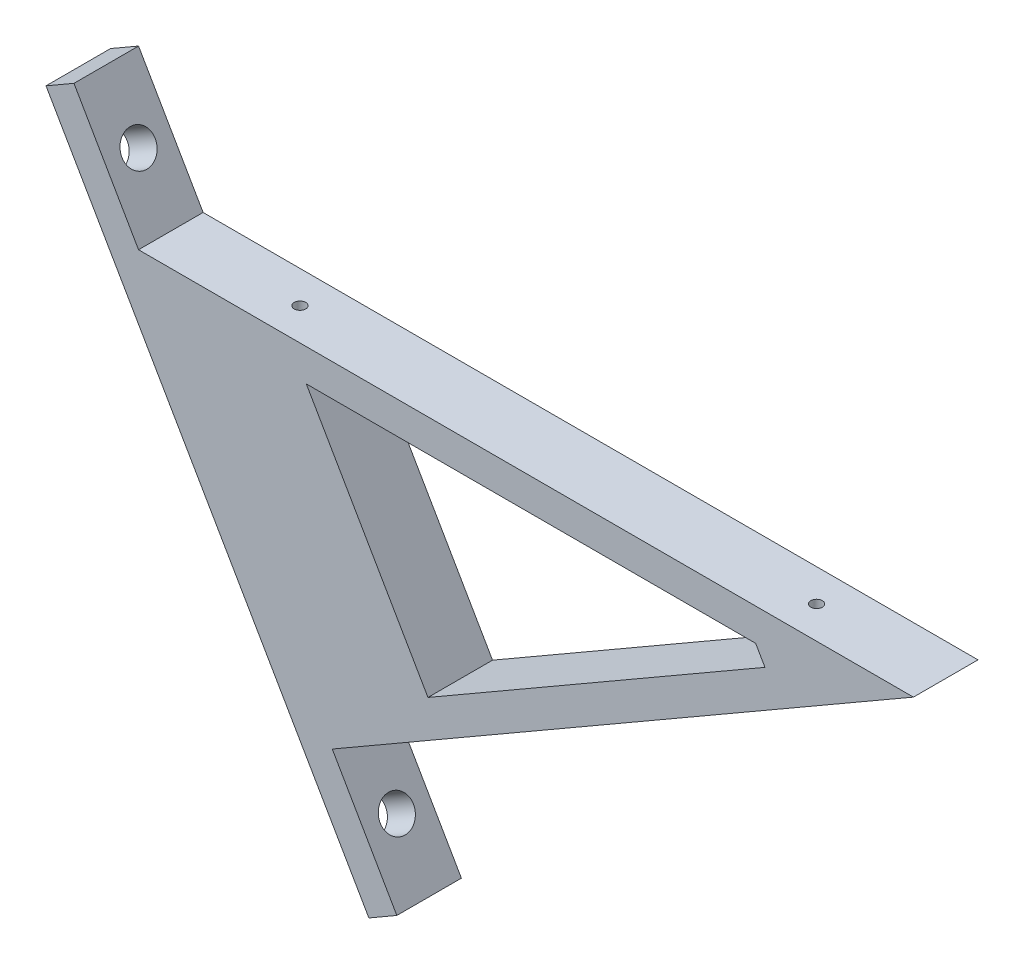
ISO-10303-21;
HEADER;
FILE_DESCRIPTION(('STEP AP214'),'2;1');
FILE_NAME('part.step','',(''),(''),'','','');
FILE_SCHEMA(('AUTOMOTIVE_DESIGN { 1 0 10303 214 1 1 1 1 }'));
ENDSEC;
DATA;
#1=APPLICATION_CONTEXT('core data for automotive mechanical design processes');
#2=APPLICATION_PROTOCOL_DEFINITION('international standard','automotive_design',2000,#1);
#3=PRODUCT_CONTEXT('',#1,'mechanical');
#4=PRODUCT('Part','Part','',(#3));
#5=PRODUCT_RELATED_PRODUCT_CATEGORY('part','',(#4));
#6=PRODUCT_DEFINITION_FORMATION('','',#4);
#7=PRODUCT_DEFINITION_CONTEXT('part definition',#1,'design');
#8=PRODUCT_DEFINITION('design','',#6,#7);
#9=PRODUCT_DEFINITION_SHAPE('','',#8);
#10=(LENGTH_UNIT() NAMED_UNIT(*) SI_UNIT(.MILLI.,.METRE.));
#11=(NAMED_UNIT(*) PLANE_ANGLE_UNIT() SI_UNIT($,.RADIAN.));
#12=(NAMED_UNIT(*) SI_UNIT($,.STERADIAN.) SOLID_ANGLE_UNIT());
#13=UNCERTAINTY_MEASURE_WITH_UNIT(LENGTH_MEASURE(1.E-05),#10,'distance_accuracy_value','');
#14=(GEOMETRIC_REPRESENTATION_CONTEXT(3) GLOBAL_UNCERTAINTY_ASSIGNED_CONTEXT((#13)) GLOBAL_UNIT_ASSIGNED_CONTEXT((#10,
#11,#12)) REPRESENTATION_CONTEXT('',''));
#15=CARTESIAN_POINT('',(0.,0.,0.));
#16=DIRECTION('',(0.,0.,1.));
#17=DIRECTION('',(1.,0.,0.));
#18=AXIS2_PLACEMENT_3D('',#15,#16,#17);
#19=CARTESIAN_POINT('',(0.,-6.35000000000023,12.7));
#20=DIRECTION('',(0.,1.,0.));
#21=DIRECTION('',(0.,0.,1.));
#22=AXIS2_PLACEMENT_3D('',#19,#20,#21);
#23=PLANE('',#22);
#24=DIRECTION('',(1.,0.,0.));
#25=VECTOR('',#24,1.);
#26=CARTESIAN_POINT('',(0.,-6.35000000000023,0.));
#27=LINE('',#26,#25);
#28=CARTESIAN_POINT('',(-119.404432115813,-6.35000000000023,0.));
#29=VERTEX_POINT('',#28);
#30=CARTESIAN_POINT('',(-31.0308710467701,-6.35000000000023,0.));
#31=VERTEX_POINT('',#30);
#32=EDGE_CURVE('E175',#29,#31,#27,.T.);
#33=ORIENTED_EDGE('',*,*,#32,.T.);
#34=DIRECTION('',(0.,0.,-1.));
#35=VECTOR('',#34,1.);
#36=CARTESIAN_POINT('',(-31.0308710467701,-6.35000000000023,12.7));
#37=LINE('',#36,#35);
#38=CARTESIAN_POINT('',(-31.0308710467701,-6.35000000000023,12.7));
#39=VERTEX_POINT('',#38);
#40=EDGE_CURVE('E11',#39,#31,#37,.T.);
#41=ORIENTED_EDGE('',*,*,#40,.F.);
#42=DIRECTION('',(1.,0.,0.));
#43=VECTOR('',#42,1.);
#44=CARTESIAN_POINT('',(0.,-6.35000000000023,12.7));
#45=LINE('',#44,#43);
#46=CARTESIAN_POINT('',(-119.404432115813,-6.35000000000023,12.7));
#47=VERTEX_POINT('',#46);
#48=EDGE_CURVE('E141',#47,#39,#45,.T.);
#49=ORIENTED_EDGE('',*,*,#48,.F.);
#50=DIRECTION('',(0.,0.,-1.));
#51=VECTOR('',#50,1.);
#52=CARTESIAN_POINT('',(-119.404432115813,-6.35000000000023,12.7));
#53=LINE('',#52,#51);
#54=EDGE_CURVE('E182',#47,#29,#53,.T.);
#55=ORIENTED_EDGE('',*,*,#54,.T.);
#56=EDGE_LOOP('',(#33,#41,#49,#55));
#57=FACE_BOUND('',#56,.T.);
#58=ADVANCED_FACE('F41',(#57),#23,.F.);
#59=CARTESIAN_POINT('',(-26.0227839420932,-15.0242613140311,12.7));
#60=DIRECTION('',(0.866025403784436,0.500000000000005,0.));
#61=DIRECTION('',(-0.500000000000005,0.866025403784436,0.));
#62=AXIS2_PLACEMENT_3D('',#59,#60,#61);
#63=PLANE('',#62);
#64=DIRECTION('',(0.500000000000005,-0.866025403784436,0.));
#65=VECTOR('',#64,1.);
#66=CARTESIAN_POINT('',(-26.0227839420932,-15.0242613140311,0.));
#67=LINE('',#66,#65);
#68=CARTESIAN_POINT('',(-29.197783942093,-9.52500000000024,0.));
#69=VERTEX_POINT('',#68);
#70=EDGE_CURVE('E146',#31,#69,#67,.T.);
#71=ORIENTED_EDGE('',*,*,#70,.T.);
#72=DIRECTION('',(0.,0.,-1.));
#73=VECTOR('',#72,1.);
#74=CARTESIAN_POINT('',(-29.197783942093,-9.52500000000024,12.7));
#75=LINE('',#74,#73);
#76=CARTESIAN_POINT('',(-29.197783942093,-9.52500000000024,12.7));
#77=VERTEX_POINT('',#76);
#78=EDGE_CURVE('E51',#77,#69,#75,.T.);
#79=ORIENTED_EDGE('',*,*,#78,.F.);
#80=DIRECTION('',(0.500000000000005,-0.866025403784436,0.));
#81=VECTOR('',#80,1.);
#82=CARTESIAN_POINT('',(-26.0227839420932,-15.0242613140311,12.7));
#83=LINE('',#82,#81);
#84=EDGE_CURVE('E135',#39,#77,#83,.T.);
#85=ORIENTED_EDGE('',*,*,#84,.F.);
#86=ORIENTED_EDGE('',*,*,#40,.T.);
#87=EDGE_LOOP('',(#71,#79,#85,#86));
#88=FACE_BOUND('',#87,.T.);
#89=ADVANCED_FACE('F145',(#88),#63,.F.);
#90=CARTESIAN_POINT('',(-3.17499999999995,5.49926131403098,12.7));
#91=DIRECTION('',(0.500000000000007,-0.866025403784434,0.));
#92=DIRECTION('',(0.866025403784434,0.500000000000008,0.));
#93=AXIS2_PLACEMENT_3D('',#90,#91,#92);
#94=PLANE('',#93);
#95=DIRECTION('',(-0.866025403784434,-0.500000000000008,0.));
#96=VECTOR('',#95,1.);
#97=CARTESIAN_POINT('',(-3.17499999999995,5.49926131403098,0.));
#98=LINE('',#97,#96);
#99=CARTESIAN_POINT('',(-95.4779547438745,-47.7918744543439,0.));
#100=VERTEX_POINT('',#99);
#101=EDGE_CURVE('E98',#69,#100,#98,.T.);
#102=ORIENTED_EDGE('',*,*,#101,.T.);
#103=DIRECTION('',(0.,0.,-1.));
#104=VECTOR('',#103,1.);
#105=CARTESIAN_POINT('',(-95.4779547438745,-47.7918744543439,12.7));
#106=LINE('',#105,#104);
#107=CARTESIAN_POINT('',(-95.4779547438745,-47.7918744543439,12.7));
#108=VERTEX_POINT('',#107);
#109=EDGE_CURVE('E147',#108,#100,#106,.T.);
#110=ORIENTED_EDGE('',*,*,#109,.F.);
#111=DIRECTION('',(-0.866025403784434,-0.500000000000008,0.));
#112=VECTOR('',#111,1.);
#113=CARTESIAN_POINT('',(-3.17499999999995,5.49926131403098,12.7));
#114=LINE('',#113,#112);
#115=EDGE_CURVE('E139',#77,#108,#114,.T.);
#116=ORIENTED_EDGE('',*,*,#115,.F.);
#117=ORIENTED_EDGE('',*,*,#78,.T.);
#118=EDGE_LOOP('',(#102,#110,#116,#117));
#119=FACE_BOUND('',#118,.T.);
#120=ADVANCED_FACE('F149',(#119),#94,.F.);
#121=CARTESIAN_POINT('',(0.,0.,12.7));
#122=DIRECTION('',(0.,1.,0.));
#123=DIRECTION('',(-1.,0.,0.));
#124=AXIS2_PLACEMENT_3D('',#121,#122,#123);
#125=PLANE('',#124);
#126=CARTESIAN_POINT('',(-127.,-1.89677496629516E-13,6.35));
#127=DIRECTION('',(0.,1.,0.));
#128=DIRECTION('',(-1.,0.,0.));
#129=AXIS2_PLACEMENT_3D('',#126,#127,#128);
#130=CIRCLE('',#129,1.13029999999999);
#131=CARTESIAN_POINT('',(-128.1303,-1.91365626349519E-13,6.35));
#132=VERTEX_POINT('',#131);
#133=EDGE_CURVE('E251',#132,#132,#130,.T.);
#134=ORIENTED_EDGE('',*,*,#133,.F.);
#135=EDGE_LOOP('',(#134));
#136=FACE_BOUND('',#135,.T.);
#137=CARTESIAN_POINT('',(-25.4,0.,6.35));
#138=DIRECTION('',(0.,1.,0.));
#139=DIRECTION('',(-1.,0.,0.));
#140=AXIS2_PLACEMENT_3D('',#137,#138,#139);
#141=CIRCLE('',#140,1.1303);
#142=CARTESIAN_POINT('',(-26.5303,0.,6.35));
#143=VERTEX_POINT('',#142);
#144=EDGE_CURVE('E248',#143,#143,#141,.T.);
#145=ORIENTED_EDGE('',*,*,#144,.F.);
#146=EDGE_LOOP('',(#145));
#147=FACE_BOUND('',#146,.T.);
#148=DIRECTION('',(1.,0.,0.));
#149=VECTOR('',#148,1.);
#150=CARTESIAN_POINT('',(0.,0.,0.));
#151=LINE('',#150,#149);
#152=CARTESIAN_POINT('',(-152.4,-2.22044604925031E-13,0.));
#153=VERTEX_POINT('',#152);
#154=CARTESIAN_POINT('',(0.,0.,0.));
#155=VERTEX_POINT('',#154);
#156=EDGE_CURVE('E155',#153,#155,#151,.T.);
#157=ORIENTED_EDGE('',*,*,#156,.F.);
#158=DIRECTION('',(0.,0.,-1.));
#159=VECTOR('',#158,1.);
#160=CARTESIAN_POINT('',(-152.4,-2.22044604925031E-13,12.7));
#161=LINE('',#160,#159);
#162=CARTESIAN_POINT('',(-152.4,-2.22044604925031E-13,12.7));
#163=VERTEX_POINT('',#162);
#164=EDGE_CURVE('E112',#163,#153,#161,.T.);
#165=ORIENTED_EDGE('',*,*,#164,.F.);
#166=DIRECTION('',(1.,0.,0.));
#167=VECTOR('',#166,1.);
#168=CARTESIAN_POINT('',(0.,0.,12.7));
#169=LINE('',#168,#167);
#170=CARTESIAN_POINT('',(0.,0.,12.7));
#171=VERTEX_POINT('',#170);
#172=EDGE_CURVE('E181',#163,#171,#169,.T.);
#173=ORIENTED_EDGE('',*,*,#172,.T.);
#174=DIRECTION('',(0.,0.,-1.));
#175=VECTOR('',#174,1.);
#176=CARTESIAN_POINT('',(0.,0.,12.7));
#177=LINE('',#176,#175);
#178=EDGE_CURVE('E151',#171,#155,#177,.T.);
#179=ORIENTED_EDGE('',*,*,#178,.T.);
#180=EDGE_LOOP('',(#157,#165,#173,#179));
#181=FACE_BOUND('',#180,.T.);
#182=ADVANCED_FACE('F43',(#136,#147,#181),#125,.T.);
#183=CARTESIAN_POINT('',(-114.299999999999,-65.9911357683749,12.7));
#184=DIRECTION('',(-0.866025403784434,-0.500000000000008,0.));
#185=DIRECTION('',(0.500000000000008,-0.866025403784434,0.));
#186=AXIS2_PLACEMENT_3D('',#183,#184,#185);
#187=PLANE('',#186);
#188=CARTESIAN_POINT('',(-158.75,10.9985226280621,6.35));
#189=DIRECTION('',(0.866025403784434,0.500000000000008,0.));
#190=DIRECTION('',(-0.500000000000008,0.866025403784434,0.));
#191=AXIS2_PLACEMENT_3D('',#188,#189,#190);
#192=CIRCLE('',#191,3.2639);
#193=CARTESIAN_POINT('',(-160.38195,13.8251429434741,6.35));
#194=VERTEX_POINT('',#193);
#195=EDGE_CURVE('E259',#194,#194,#192,.T.);
#196=ORIENTED_EDGE('',*,*,#195,.F.);
#197=EDGE_LOOP('',(#196));
#198=FACE_BOUND('',#197,.T.);
#199=DIRECTION('',(-0.500000000000008,0.866025403784434,0.));
#200=VECTOR('',#199,1.);
#201=CARTESIAN_POINT('',(-114.299999999999,-65.9911357683749,0.));
#202=LINE('',#201,#200);
#203=CARTESIAN_POINT('',(-165.1,21.9970452561244,0.));
#204=VERTEX_POINT('',#203);
#205=EDGE_CURVE('E158',#153,#204,#202,.T.);
#206=ORIENTED_EDGE('',*,*,#205,.T.);
#207=DIRECTION('',(0.,0.,-1.));
#208=VECTOR('',#207,1.);
#209=CARTESIAN_POINT('',(-165.1,21.9970452561244,12.7));
#210=LINE('',#209,#208);
#211=CARTESIAN_POINT('',(-165.1,21.9970452561244,12.7));
#212=VERTEX_POINT('',#211);
#213=EDGE_CURVE('E195',#212,#204,#210,.T.);
#214=ORIENTED_EDGE('',*,*,#213,.F.);
#215=DIRECTION('',(-0.500000000000008,0.866025403784434,0.));
#216=VECTOR('',#215,1.);
#217=CARTESIAN_POINT('',(-114.299999999999,-65.9911357683749,12.7));
#218=LINE('',#217,#216);
#219=EDGE_CURVE('E201',#163,#212,#218,.T.);
#220=ORIENTED_EDGE('',*,*,#219,.F.);
#221=ORIENTED_EDGE('',*,*,#164,.T.);
#222=EDGE_LOOP('',(#206,#214,#220,#221));
#223=FACE_BOUND('',#222,.T.);
#224=ADVANCED_FACE('F199',(#198,#223),#187,.F.);
#225=CARTESIAN_POINT('',(-50.8000000000015,87.9881810244994,12.7));
#226=DIRECTION('',(0.500000000000009,-0.866025403784433,0.));
#227=DIRECTION('',(0.866025403784433,0.500000000000009,0.));
#228=AXIS2_PLACEMENT_3D('',#225,#226,#227);
#229=PLANE('',#228);
#230=DIRECTION('',(-0.866025403784433,-0.500000000000009,0.));
#231=VECTOR('',#230,1.);
#232=CARTESIAN_POINT('',(-50.8000000000015,87.9881810244994,0.));
#233=LINE('',#232,#231);
#234=CARTESIAN_POINT('',(-170.599261314031,18.8220452561244,0.));
#235=VERTEX_POINT('',#234);
#236=EDGE_CURVE('E161',#204,#235,#233,.T.);
#237=ORIENTED_EDGE('',*,*,#236,.T.);
#238=DIRECTION('',(0.,0.,-1.));
#239=VECTOR('',#238,1.);
#240=CARTESIAN_POINT('',(-170.599261314031,18.8220452561244,12.7));
#241=LINE('',#240,#239);
#242=CARTESIAN_POINT('',(-170.599261314031,18.8220452561244,12.7));
#243=VERTEX_POINT('',#242);
#244=EDGE_CURVE('E192',#243,#235,#241,.T.);
#245=ORIENTED_EDGE('',*,*,#244,.F.);
#246=DIRECTION('',(-0.866025403784433,-0.500000000000009,0.));
#247=VECTOR('',#246,1.);
#248=CARTESIAN_POINT('',(-50.8000000000015,87.9881810244994,12.7));
#249=LINE('',#248,#247);
#250=EDGE_CURVE('E235',#212,#243,#249,.T.);
#251=ORIENTED_EDGE('',*,*,#250,.F.);
#252=ORIENTED_EDGE('',*,*,#213,.T.);
#253=EDGE_LOOP('',(#237,#245,#251,#252));
#254=FACE_BOUND('',#253,.T.);
#255=ADVANCED_FACE('F234',(#254),#229,.F.);
#256=CARTESIAN_POINT('',(-119.799261314031,-69.1661357683746,12.7));
#257=DIRECTION('',(0.866025403784436,0.500000000000004,0.));
#258=DIRECTION('',(-0.500000000000004,0.866025403784436,0.));
#259=AXIS2_PLACEMENT_3D('',#256,#257,#258);
#260=PLANE('',#259);
#261=CARTESIAN_POINT('',(-164.249261314031,7.82352262806212,6.35));
#262=DIRECTION('',(0.866025403784436,0.500000000000004,0.));
#263=DIRECTION('',(-0.500000000000004,0.866025403784436,0.));
#264=AXIS2_PLACEMENT_3D('',#261,#262,#263);
#265=CIRCLE('',#264,3.2639);
#266=CARTESIAN_POINT('',(-165.881211314031,10.6501429434741,6.35));
#267=VERTEX_POINT('',#266);
#268=EDGE_CURVE('E45',#267,#267,#265,.T.);
#269=ORIENTED_EDGE('',*,*,#268,.T.);
#270=EDGE_LOOP('',(#269));
#271=FACE_BOUND('',#270,.T.);
#272=CARTESIAN_POINT('',(-113.449261314031,-80.1646583964366,6.35));
#273=DIRECTION('',(0.866025403784436,0.500000000000004,0.));
#274=DIRECTION('',(-0.500000000000004,0.866025403784436,0.));
#275=AXIS2_PLACEMENT_3D('',#272,#273,#274);
#276=CIRCLE('',#275,3.2639);
#277=CARTESIAN_POINT('',(-115.081211314031,-77.3380380810246,6.35));
#278=VERTEX_POINT('',#277);
#279=EDGE_CURVE('E256',#278,#278,#276,.T.);
#280=ORIENTED_EDGE('',*,*,#279,.T.);
#281=EDGE_LOOP('',(#280));
#282=FACE_BOUND('',#281,.T.);
#283=DIRECTION('',(0.500000000000004,-0.866025403784436,0.));
#284=VECTOR('',#283,1.);
#285=CARTESIAN_POINT('',(-119.799261314031,-69.1661357683746,0.));
#286=LINE('',#285,#284);
#287=CARTESIAN_POINT('',(-107.09926131403,-91.1631810244999,0.));
#288=VERTEX_POINT('',#287);
#289=EDGE_CURVE('E163',#235,#288,#286,.T.);
#290=ORIENTED_EDGE('',*,*,#289,.T.);
#291=DIRECTION('',(0.,0.,-1.));
#292=VECTOR('',#291,1.);
#293=CARTESIAN_POINT('',(-107.09926131403,-91.1631810244999,12.7));
#294=LINE('',#293,#292);
#295=CARTESIAN_POINT('',(-107.09926131403,-91.1631810244999,12.7));
#296=VERTEX_POINT('',#295);
#297=EDGE_CURVE('E190',#296,#288,#294,.T.);
#298=ORIENTED_EDGE('',*,*,#297,.F.);
#299=DIRECTION('',(0.500000000000004,-0.866025403784436,0.));
#300=VECTOR('',#299,1.);
#301=CARTESIAN_POINT('',(-119.799261314031,-69.1661357683746,12.7));
#302=LINE('',#301,#300);
#303=EDGE_CURVE('E231',#243,#296,#302,.T.);
#304=ORIENTED_EDGE('',*,*,#303,.F.);
#305=ORIENTED_EDGE('',*,*,#244,.T.);
#306=EDGE_LOOP('',(#290,#298,#304,#305));
#307=FACE_BOUND('',#306,.T.);
#308=ADVANCED_FACE('F229',(#271,#282,#307),#260,.F.);
#309=CARTESIAN_POINT('',(12.7000000000005,-21.9970452561255,12.7));
#310=DIRECTION('',(0.500000000000003,-0.866025403784437,0.));
#311=DIRECTION('',(0.866025403784437,0.500000000000003,0.));
#312=AXIS2_PLACEMENT_3D('',#309,#310,#311);
#313=PLANE('',#312);
#314=DIRECTION('',(-0.866025403784437,-0.500000000000003,0.));
#315=VECTOR('',#314,1.);
#316=CARTESIAN_POINT('',(12.7000000000005,-21.9970452561255,0.));
#317=LINE('',#316,#315);
#318=CARTESIAN_POINT('',(-101.599999999999,-87.9881810244999,0.));
#319=VERTEX_POINT('',#318);
#320=EDGE_CURVE('E166',#319,#288,#317,.T.);
#321=ORIENTED_EDGE('',*,*,#320,.F.);
#322=DIRECTION('',(0.,0.,-1.));
#323=VECTOR('',#322,1.);
#324=CARTESIAN_POINT('',(-101.599999999999,-87.9881810244999,12.7));
#325=LINE('',#324,#323);
#326=CARTESIAN_POINT('',(-101.599999999999,-87.9881810244999,12.7));
#327=VERTEX_POINT('',#326);
#328=EDGE_CURVE('E188',#327,#319,#325,.T.);
#329=ORIENTED_EDGE('',*,*,#328,.F.);
#330=DIRECTION('',(-0.866025403784437,-0.500000000000003,0.));
#331=VECTOR('',#330,1.);
#332=CARTESIAN_POINT('',(12.7000000000005,-21.9970452561255,12.7));
#333=LINE('',#332,#331);
#334=EDGE_CURVE('E226',#327,#296,#333,.T.);
#335=ORIENTED_EDGE('',*,*,#334,.T.);
#336=ORIENTED_EDGE('',*,*,#297,.T.);
#337=EDGE_LOOP('',(#321,#329,#335,#336));
#338=FACE_BOUND('',#337,.T.);
#339=ADVANCED_FACE('F224',(#338),#313,.T.);
#340=CARTESIAN_POINT('',(-114.299999999999,-65.9911357683747,12.7));
#341=DIRECTION('',(0.866025403784436,0.500000000000005,0.));
#342=DIRECTION('',(-0.500000000000005,0.866025403784436,0.));
#343=AXIS2_PLACEMENT_3D('',#340,#341,#342);
#344=PLANE('',#343);
#345=CARTESIAN_POINT('',(-107.949999999999,-76.9896583964364,6.35));
#346=DIRECTION('',(0.866025403784434,0.500000000000008,0.));
#347=DIRECTION('',(-0.500000000000008,0.866025403784434,0.));
#348=AXIS2_PLACEMENT_3D('',#345,#346,#347);
#349=CIRCLE('',#348,3.2639);
#350=CARTESIAN_POINT('',(-109.581949999999,-74.1630380810244,6.35));
#351=VERTEX_POINT('',#350);
#352=EDGE_CURVE('E260',#351,#351,#349,.T.);
#353=ORIENTED_EDGE('',*,*,#352,.F.);
#354=EDGE_LOOP('',(#353));
#355=FACE_BOUND('',#354,.T.);
#356=DIRECTION('',(0.500000000000005,-0.866025403784436,0.));
#357=VECTOR('',#356,1.);
#358=CARTESIAN_POINT('',(-114.299999999999,-65.9911357683747,0.));
#359=LINE('',#358,#357);
#360=CARTESIAN_POINT('',(-114.299999999999,-65.9911357683752,0.));
#361=VERTEX_POINT('',#360);
#362=EDGE_CURVE('E169',#361,#319,#359,.T.);
#363=ORIENTED_EDGE('',*,*,#362,.F.);
#364=DIRECTION('',(0.,0.,-1.));
#365=VECTOR('',#364,1.);
#366=CARTESIAN_POINT('',(-114.299999999999,-65.9911357683752,12.7));
#367=LINE('',#366,#365);
#368=CARTESIAN_POINT('',(-114.299999999999,-65.9911357683752,12.7));
#369=VERTEX_POINT('',#368);
#370=EDGE_CURVE('E186',#369,#361,#367,.T.);
#371=ORIENTED_EDGE('',*,*,#370,.F.);
#372=DIRECTION('',(0.500000000000005,-0.866025403784436,0.));
#373=VECTOR('',#372,1.);
#374=CARTESIAN_POINT('',(-114.299999999999,-65.9911357683747,12.7));
#375=LINE('',#374,#373);
#376=EDGE_CURVE('E220',#369,#327,#375,.T.);
#377=ORIENTED_EDGE('',*,*,#376,.T.);
#378=ORIENTED_EDGE('',*,*,#328,.T.);
#379=EDGE_LOOP('',(#363,#371,#377,#378));
#380=FACE_BOUND('',#379,.T.);
#381=ADVANCED_FACE('F217',(#355,#380),#344,.T.);
#382=CARTESIAN_POINT('',(0.,0.,12.7));
#383=DIRECTION('',(0.500000000000009,-0.866025403784433,0.));
#384=DIRECTION('',(0.866025403784434,0.500000000000009,0.));
#385=AXIS2_PLACEMENT_3D('',#382,#383,#384);
#386=PLANE('',#385);
#387=DIRECTION('',(-0.866025403784434,-0.500000000000009,0.));
#388=VECTOR('',#387,1.);
#389=CARTESIAN_POINT('',(0.,0.,0.));
#390=LINE('',#389,#388);
#391=EDGE_CURVE('E172',#155,#361,#390,.T.);
#392=ORIENTED_EDGE('',*,*,#391,.F.);
#393=ORIENTED_EDGE('',*,*,#178,.F.);
#394=DIRECTION('',(-0.866025403784434,-0.500000000000009,0.));
#395=VECTOR('',#394,1.);
#396=CARTESIAN_POINT('',(0.,0.,12.7));
#397=LINE('',#396,#395);
#398=EDGE_CURVE('E213',#171,#369,#397,.T.);
#399=ORIENTED_EDGE('',*,*,#398,.T.);
#400=ORIENTED_EDGE('',*,*,#370,.T.);
#401=EDGE_LOOP('',(#392,#393,#399,#400));
#402=FACE_BOUND('',#401,.T.);
#403=ADVANCED_FACE('F212',(#402),#386,.T.);
#404=CARTESIAN_POINT('',(-92.3029547438748,-53.2911357683745,12.7));
#405=DIRECTION('',(-0.866025403784436,-0.500000000000004,0.));
#406=DIRECTION('',(0.500000000000004,-0.866025403784437,0.));
#407=AXIS2_PLACEMENT_3D('',#404,#405,#406);
#408=PLANE('',#407);
#409=DIRECTION('',(-0.500000000000004,0.866025403784436,0.));
#410=VECTOR('',#409,1.);
#411=CARTESIAN_POINT('',(-92.3029547438748,-53.2911357683745,0.));
#412=LINE('',#411,#410);
#413=EDGE_CURVE('E104',#100,#29,#412,.T.);
#414=ORIENTED_EDGE('',*,*,#413,.T.);
#415=ORIENTED_EDGE('',*,*,#54,.F.);
#416=DIRECTION('',(-0.500000000000004,0.866025403784436,0.));
#417=VECTOR('',#416,1.);
#418=CARTESIAN_POINT('',(-92.3029547438748,-53.2911357683745,12.7));
#419=LINE('',#418,#417);
#420=EDGE_CURVE('E60',#108,#47,#419,.T.);
#421=ORIENTED_EDGE('',*,*,#420,.F.);
#422=ORIENTED_EDGE('',*,*,#109,.T.);
#423=EDGE_LOOP('',(#414,#415,#421,#422));
#424=FACE_BOUND('',#423,.T.);
#425=ADVANCED_FACE('F289',(#424),#408,.F.);
#426=CARTESIAN_POINT('',(0.,0.,12.7));
#427=DIRECTION('',(0.,0.,1.));
#428=DIRECTION('',(1.,0.,0.));
#429=AXIS2_PLACEMENT_3D('',#426,#427,#428);
#430=PLANE('',#429);
#431=ORIENTED_EDGE('',*,*,#172,.F.);
#432=ORIENTED_EDGE('',*,*,#219,.T.);
#433=ORIENTED_EDGE('',*,*,#250,.T.);
#434=ORIENTED_EDGE('',*,*,#303,.T.);
#435=ORIENTED_EDGE('',*,*,#334,.F.);
#436=ORIENTED_EDGE('',*,*,#376,.F.);
#437=ORIENTED_EDGE('',*,*,#398,.F.);
#438=EDGE_LOOP('',(#431,#432,#433,#434,#435,#436,#437));
#439=FACE_BOUND('',#438,.T.);
#440=ORIENTED_EDGE('',*,*,#48,.T.);
#441=ORIENTED_EDGE('',*,*,#84,.T.);
#442=ORIENTED_EDGE('',*,*,#115,.T.);
#443=ORIENTED_EDGE('',*,*,#420,.T.);
#444=EDGE_LOOP('',(#440,#441,#442,#443));
#445=FACE_BOUND('',#444,.T.);
#446=ADVANCED_FACE('F137',(#439,#445),#430,.T.);
#447=CARTESIAN_POINT('',(0.,0.,0.));
#448=DIRECTION('',(0.,0.,1.));
#449=DIRECTION('',(1.,0.,0.));
#450=AXIS2_PLACEMENT_3D('',#447,#448,#449);
#451=PLANE('',#450);
#452=ORIENTED_EDGE('',*,*,#156,.T.);
#453=ORIENTED_EDGE('',*,*,#391,.T.);
#454=ORIENTED_EDGE('',*,*,#362,.T.);
#455=ORIENTED_EDGE('',*,*,#320,.T.);
#456=ORIENTED_EDGE('',*,*,#289,.F.);
#457=ORIENTED_EDGE('',*,*,#236,.F.);
#458=ORIENTED_EDGE('',*,*,#205,.F.);
#459=EDGE_LOOP('',(#452,#453,#454,#455,#456,#457,#458));
#460=FACE_BOUND('',#459,.T.);
#461=ORIENTED_EDGE('',*,*,#32,.F.);
#462=ORIENTED_EDGE('',*,*,#413,.F.);
#463=ORIENTED_EDGE('',*,*,#101,.F.);
#464=ORIENTED_EDGE('',*,*,#70,.F.);
#465=EDGE_LOOP('',(#461,#462,#463,#464));
#466=FACE_BOUND('',#465,.T.);
#467=ADVANCED_FACE('F205',(#460,#466),#451,.F.);
#468=CARTESIAN_POINT('',(-25.4,-10.,6.35));
#469=DIRECTION('',(0.,1.,0.));
#470=DIRECTION('',(-1.,0.,0.));
#471=AXIS2_PLACEMENT_3D('',#468,#469,#470);
#472=CYLINDRICAL_SURFACE('',#471,1.1303);
#473=CARTESIAN_POINT('',(-25.4,-10.,6.35));
#474=DIRECTION('',(0.,1.,0.));
#475=DIRECTION('',(-1.,0.,0.));
#476=AXIS2_PLACEMENT_3D('',#473,#474,#475);
#477=CIRCLE('',#476,1.1303);
#478=CARTESIAN_POINT('',(-26.5303,-10.,6.35));
#479=VERTEX_POINT('',#478);
#480=EDGE_CURVE('E245',#479,#479,#477,.T.);
#481=ORIENTED_EDGE('',*,*,#480,.F.);
#482=EDGE_LOOP('',(#481));
#483=FACE_BOUND('',#482,.T.);
#484=ORIENTED_EDGE('',*,*,#144,.T.);
#485=EDGE_LOOP('',(#484));
#486=FACE_BOUND('',#485,.T.);
#487=ADVANCED_FACE('F321',(#483,#486),#472,.F.);
#488=CARTESIAN_POINT('',(-25.4,-10.,6.35));
#489=DIRECTION('',(0.,1.,0.));
#490=DIRECTION('',(-1.,0.,0.));
#491=AXIS2_PLACEMENT_3D('',#488,#489,#490);
#492=PLANE('',#491);
#493=ORIENTED_EDGE('',*,*,#480,.T.);
#494=EDGE_LOOP('',(#493));
#495=FACE_BOUND('',#494,.T.);
#496=ADVANCED_FACE('F319',(#495),#492,.T.);
#497=CARTESIAN_POINT('',(-127.,-10.0000000000002,6.35));
#498=DIRECTION('',(0.,1.,0.));
#499=DIRECTION('',(-1.,0.,0.));
#500=AXIS2_PLACEMENT_3D('',#497,#498,#499);
#501=CYLINDRICAL_SURFACE('',#500,1.13029999999999);
#502=CARTESIAN_POINT('',(-127.,-10.0000000000002,6.35));
#503=DIRECTION('',(0.,1.,0.));
#504=DIRECTION('',(-1.,0.,0.));
#505=AXIS2_PLACEMENT_3D('',#502,#503,#504);
#506=CIRCLE('',#505,1.13029999999999);
#507=CARTESIAN_POINT('',(-128.1303,-10.0000000000002,6.35));
#508=VERTEX_POINT('',#507);
#509=EDGE_CURVE('E159',#508,#508,#506,.T.);
#510=ORIENTED_EDGE('',*,*,#509,.F.);
#511=EDGE_LOOP('',(#510));
#512=FACE_BOUND('',#511,.T.);
#513=ORIENTED_EDGE('',*,*,#133,.T.);
#514=EDGE_LOOP('',(#513));
#515=FACE_BOUND('',#514,.T.);
#516=ADVANCED_FACE('F313',(#512,#515),#501,.F.);
#517=CARTESIAN_POINT('',(-127.,-10.0000000000002,6.35));
#518=DIRECTION('',(0.,1.,0.));
#519=DIRECTION('',(-1.,0.,0.));
#520=AXIS2_PLACEMENT_3D('',#517,#518,#519);
#521=PLANE('',#520);
#522=ORIENTED_EDGE('',*,*,#509,.T.);
#523=EDGE_LOOP('',(#522));
#524=FACE_BOUND('',#523,.T.);
#525=ADVANCED_FACE('F305',(#524),#521,.T.);
#526=CARTESIAN_POINT('',(-116.610254037844,-81.9896583964365,6.35));
#527=DIRECTION('',(0.866025403784434,0.500000000000008,0.));
#528=DIRECTION('',(-0.500000000000008,0.866025403784434,0.));
#529=AXIS2_PLACEMENT_3D('',#526,#527,#528);
#530=CYLINDRICAL_SURFACE('',#529,3.2639);
#531=ORIENTED_EDGE('',*,*,#352,.T.);
#532=EDGE_LOOP('',(#531));
#533=FACE_BOUND('',#532,.T.);
#534=ORIENTED_EDGE('',*,*,#279,.F.);
#535=EDGE_LOOP('',(#534));
#536=FACE_BOUND('',#535,.T.);
#537=ADVANCED_FACE('F303',(#533,#536),#530,.F.);
#538=CARTESIAN_POINT('',(-167.410254037844,5.99852262806202,6.35));
#539=DIRECTION('',(0.866025403784434,0.500000000000008,0.));
#540=DIRECTION('',(-0.500000000000008,0.866025403784434,0.));
#541=AXIS2_PLACEMENT_3D('',#538,#539,#540);
#542=CYLINDRICAL_SURFACE('',#541,3.2639);
#543=ORIENTED_EDGE('',*,*,#195,.T.);
#544=EDGE_LOOP('',(#543));
#545=FACE_BOUND('',#544,.T.);
#546=ORIENTED_EDGE('',*,*,#268,.F.);
#547=EDGE_LOOP('',(#546));
#548=FACE_BOUND('',#547,.T.);
#549=ADVANCED_FACE('F266',(#545,#548),#542,.F.);
#550=CLOSED_SHELL('',(#58,#89,#120,#182,#224,#255,#308,#339,#381,#403,#425,#446,#467,#487,#496,
#516,#525,#537,#549));
#551=MANIFOLD_SOLID_BREP('B2',#550);
#552=ADVANCED_BREP_SHAPE_REPRESENTATION('',(#18,#551),#14);
#553=SHAPE_DEFINITION_REPRESENTATION(#9,#552);
ENDSEC;
END-ISO-10303-21;
